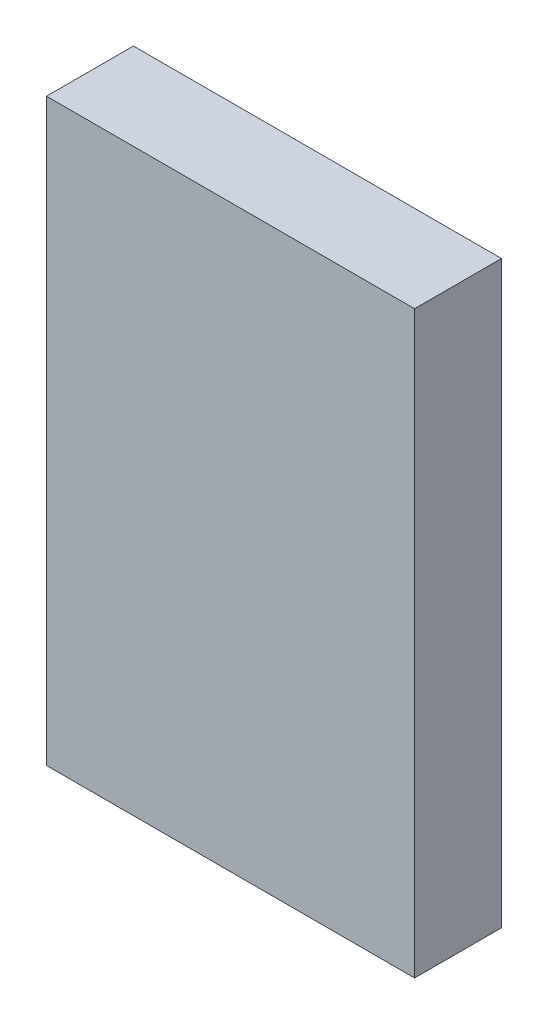
ISO-10303-21;
HEADER;
FILE_DESCRIPTION(('STEP AP214'),'2;1');
FILE_NAME('part.step','',(''),(''),'','','');
FILE_SCHEMA(('AUTOMOTIVE_DESIGN { 1 0 10303 214 1 1 1 1 }'));
ENDSEC;
DATA;
#1=APPLICATION_CONTEXT('core data for automotive mechanical design processes');
#2=APPLICATION_PROTOCOL_DEFINITION('international standard','automotive_design',2000,#1);
#3=PRODUCT_CONTEXT('',#1,'mechanical');
#4=PRODUCT('Part','Part','',(#3));
#5=PRODUCT_RELATED_PRODUCT_CATEGORY('part','',(#4));
#6=PRODUCT_DEFINITION_FORMATION('','',#4);
#7=PRODUCT_DEFINITION_CONTEXT('part definition',#1,'design');
#8=PRODUCT_DEFINITION('design','',#6,#7);
#9=PRODUCT_DEFINITION_SHAPE('','',#8);
#10=(LENGTH_UNIT() NAMED_UNIT(*) SI_UNIT(.MILLI.,.METRE.));
#11=(NAMED_UNIT(*) PLANE_ANGLE_UNIT() SI_UNIT($,.RADIAN.));
#12=(NAMED_UNIT(*) SI_UNIT($,.STERADIAN.) SOLID_ANGLE_UNIT());
#13=UNCERTAINTY_MEASURE_WITH_UNIT(LENGTH_MEASURE(1.E-05),#10,'distance_accuracy_value','');
#14=(GEOMETRIC_REPRESENTATION_CONTEXT(3) GLOBAL_UNCERTAINTY_ASSIGNED_CONTEXT((#13)) GLOBAL_UNIT_ASSIGNED_CONTEXT((#10,
#11,#12)) REPRESENTATION_CONTEXT('',''));
#15=CARTESIAN_POINT('',(0.,0.,0.));
#16=DIRECTION('',(0.,0.,1.));
#17=DIRECTION('',(1.,0.,0.));
#18=AXIS2_PLACEMENT_3D('',#15,#16,#17);
#19=CARTESIAN_POINT('',(-6.35,10.,3.));
#20=DIRECTION('',(1.,0.,0.));
#21=DIRECTION('',(0.,1.,0.));
#22=AXIS2_PLACEMENT_3D('',#19,#20,#21);
#23=PLANE('',#22);
#24=DIRECTION('',(0.,-1.,0.));
#25=VECTOR('',#24,1.);
#26=CARTESIAN_POINT('',(-6.35,10.,0.));
#27=LINE('',#26,#25);
#28=CARTESIAN_POINT('',(-6.35,10.,0.));
#29=VERTEX_POINT('',#28);
#30=CARTESIAN_POINT('',(-6.35,-10.,0.));
#31=VERTEX_POINT('',#30);
#32=EDGE_CURVE('E111',#29,#31,#27,.T.);
#33=ORIENTED_EDGE('',*,*,#32,.T.);
#34=DIRECTION('',(0.,0.,-1.));
#35=VECTOR('',#34,1.);
#36=CARTESIAN_POINT('',(-6.35,-10.,3.));
#37=LINE('',#36,#35);
#38=CARTESIAN_POINT('',(-6.35,-10.,3.));
#39=VERTEX_POINT('',#38);
#40=EDGE_CURVE('E11',#39,#31,#37,.T.);
#41=ORIENTED_EDGE('',*,*,#40,.F.);
#42=DIRECTION('',(0.,-1.,0.));
#43=VECTOR('',#42,1.);
#44=CARTESIAN_POINT('',(-6.35,10.,3.));
#45=LINE('',#44,#43);
#46=CARTESIAN_POINT('',(-6.35,10.,3.));
#47=VERTEX_POINT('',#46);
#48=EDGE_CURVE('E95',#47,#39,#45,.T.);
#49=ORIENTED_EDGE('',*,*,#48,.F.);
#50=DIRECTION('',(0.,0.,-1.));
#51=VECTOR('',#50,1.);
#52=CARTESIAN_POINT('',(-6.35,10.,3.));
#53=LINE('',#52,#51);
#54=EDGE_CURVE('E107',#47,#29,#53,.T.);
#55=ORIENTED_EDGE('',*,*,#54,.T.);
#56=EDGE_LOOP('',(#33,#41,#49,#55));
#57=FACE_BOUND('',#56,.T.);
#58=ADVANCED_FACE('F43',(#57),#23,.F.);
#59=CARTESIAN_POINT('',(-6.35,-10.,3.));
#60=DIRECTION('',(0.,1.,0.));
#61=DIRECTION('',(0.,0.,1.));
#62=AXIS2_PLACEMENT_3D('',#59,#60,#61);
#63=PLANE('',#62);
#64=DIRECTION('',(1.,0.,0.));
#65=VECTOR('',#64,1.);
#66=CARTESIAN_POINT('',(-6.35,-10.,0.));
#67=LINE('',#66,#65);
#68=CARTESIAN_POINT('',(6.35,-10.,0.));
#69=VERTEX_POINT('',#68);
#70=EDGE_CURVE('E100',#31,#69,#67,.T.);
#71=ORIENTED_EDGE('',*,*,#70,.T.);
#72=DIRECTION('',(0.,0.,-1.));
#73=VECTOR('',#72,1.);
#74=CARTESIAN_POINT('',(6.35,-10.,3.));
#75=LINE('',#74,#73);
#76=CARTESIAN_POINT('',(6.35,-10.,3.));
#77=VERTEX_POINT('',#76);
#78=EDGE_CURVE('E52',#77,#69,#75,.T.);
#79=ORIENTED_EDGE('',*,*,#78,.F.);
#80=DIRECTION('',(1.,0.,0.));
#81=VECTOR('',#80,1.);
#82=CARTESIAN_POINT('',(-6.35,-10.,3.));
#83=LINE('',#82,#81);
#84=EDGE_CURVE('E90',#39,#77,#83,.T.);
#85=ORIENTED_EDGE('',*,*,#84,.F.);
#86=ORIENTED_EDGE('',*,*,#40,.T.);
#87=EDGE_LOOP('',(#71,#79,#85,#86));
#88=FACE_BOUND('',#87,.T.);
#89=ADVANCED_FACE('F99',(#88),#63,.F.);
#90=CARTESIAN_POINT('',(6.35,10.,3.));
#91=DIRECTION('',(-1.,0.,0.));
#92=DIRECTION('',(0.,-1.,0.));
#93=AXIS2_PLACEMENT_3D('',#90,#91,#92);
#94=PLANE('',#93);
#95=DIRECTION('',(0.,1.,0.));
#96=VECTOR('',#95,1.);
#97=CARTESIAN_POINT('',(6.35,10.,0.));
#98=LINE('',#97,#96);
#99=CARTESIAN_POINT('',(6.35,10.,0.));
#100=VERTEX_POINT('',#99);
#101=EDGE_CURVE('E77',#69,#100,#98,.T.);
#102=ORIENTED_EDGE('',*,*,#101,.T.);
#103=DIRECTION('',(0.,0.,-1.));
#104=VECTOR('',#103,1.);
#105=CARTESIAN_POINT('',(6.35,10.,3.));
#106=LINE('',#105,#104);
#107=CARTESIAN_POINT('',(6.35,10.,3.));
#108=VERTEX_POINT('',#107);
#109=EDGE_CURVE('E102',#108,#100,#106,.T.);
#110=ORIENTED_EDGE('',*,*,#109,.F.);
#111=DIRECTION('',(0.,1.,0.));
#112=VECTOR('',#111,1.);
#113=CARTESIAN_POINT('',(6.35,10.,3.));
#114=LINE('',#113,#112);
#115=EDGE_CURVE('E93',#77,#108,#114,.T.);
#116=ORIENTED_EDGE('',*,*,#115,.F.);
#117=ORIENTED_EDGE('',*,*,#78,.T.);
#118=EDGE_LOOP('',(#102,#110,#116,#117));
#119=FACE_BOUND('',#118,.T.);
#120=ADVANCED_FACE('F103',(#119),#94,.F.);
#121=CARTESIAN_POINT('',(-6.35,10.,3.));
#122=DIRECTION('',(0.,-1.,0.));
#123=DIRECTION('',(0.,0.,-1.));
#124=AXIS2_PLACEMENT_3D('',#121,#122,#123);
#125=PLANE('',#124);
#126=DIRECTION('',(-1.,0.,0.));
#127=VECTOR('',#126,1.);
#128=CARTESIAN_POINT('',(-6.35,10.,0.));
#129=LINE('',#128,#127);
#130=EDGE_CURVE('E83',#100,#29,#129,.T.);
#131=ORIENTED_EDGE('',*,*,#130,.T.);
#132=ORIENTED_EDGE('',*,*,#54,.F.);
#133=DIRECTION('',(-1.,0.,0.));
#134=VECTOR('',#133,1.);
#135=CARTESIAN_POINT('',(-6.35,10.,3.));
#136=LINE('',#135,#134);
#137=EDGE_CURVE('E60',#108,#47,#136,.T.);
#138=ORIENTED_EDGE('',*,*,#137,.F.);
#139=ORIENTED_EDGE('',*,*,#109,.T.);
#140=EDGE_LOOP('',(#131,#132,#138,#139));
#141=FACE_BOUND('',#140,.T.);
#142=ADVANCED_FACE('F124',(#141),#125,.F.);
#143=CARTESIAN_POINT('',(0.,0.,3.));
#144=DIRECTION('',(0.,0.,1.));
#145=DIRECTION('',(1.,0.,0.));
#146=AXIS2_PLACEMENT_3D('',#143,#144,#145);
#147=PLANE('',#146);
#148=ORIENTED_EDGE('',*,*,#48,.T.);
#149=ORIENTED_EDGE('',*,*,#84,.T.);
#150=ORIENTED_EDGE('',*,*,#115,.T.);
#151=ORIENTED_EDGE('',*,*,#137,.T.);
#152=EDGE_LOOP('',(#148,#149,#150,#151));
#153=FACE_BOUND('',#152,.T.);
#154=ADVANCED_FACE('F91',(#153),#147,.T.);
#155=CARTESIAN_POINT('',(0.,0.,0.));
#156=DIRECTION('',(0.,0.,1.));
#157=DIRECTION('',(1.,0.,0.));
#158=AXIS2_PLACEMENT_3D('',#155,#156,#157);
#159=PLANE('',#158);
#160=ORIENTED_EDGE('',*,*,#32,.F.);
#161=ORIENTED_EDGE('',*,*,#130,.F.);
#162=ORIENTED_EDGE('',*,*,#101,.F.);
#163=ORIENTED_EDGE('',*,*,#70,.F.);
#164=EDGE_LOOP('',(#160,#161,#162,#163));
#165=FACE_BOUND('',#164,.T.);
#166=ADVANCED_FACE('F127',(#165),#159,.F.);
#167=CLOSED_SHELL('',(#58,#89,#120,#142,#154,#166));
#168=MANIFOLD_SOLID_BREP('B2',#167);
#169=ADVANCED_BREP_SHAPE_REPRESENTATION('',(#18,#168),#14);
#170=SHAPE_DEFINITION_REPRESENTATION(#9,#169);
ENDSEC;
END-ISO-10303-21;
